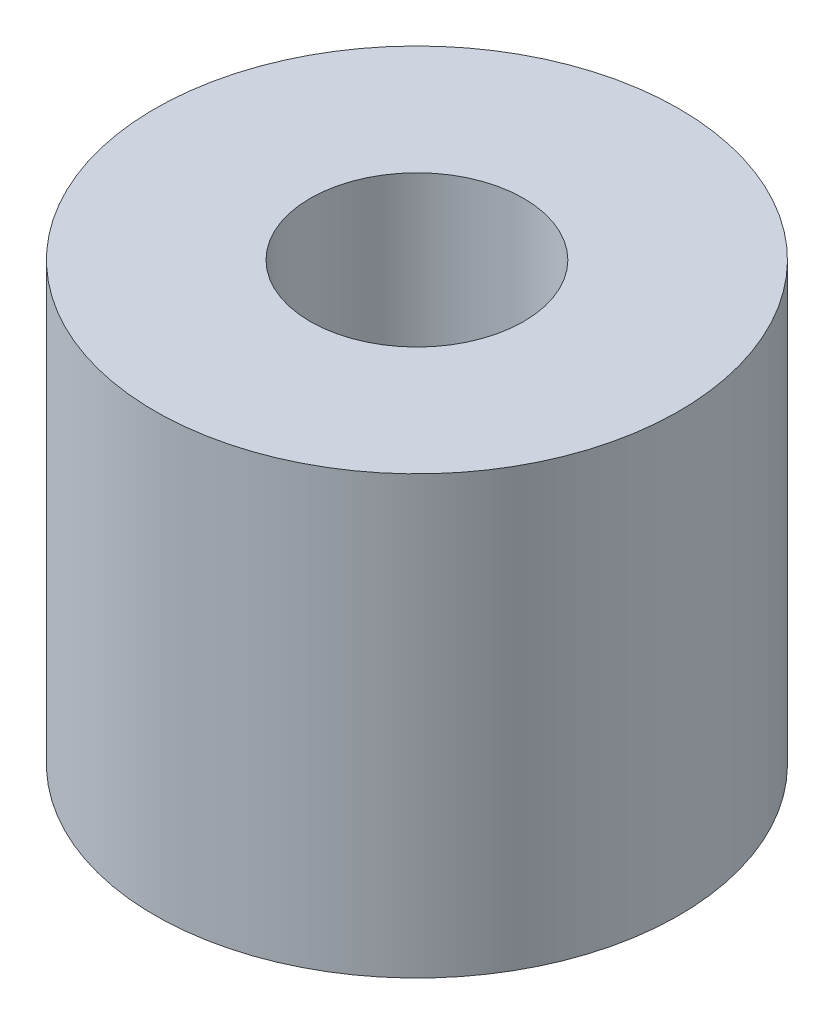
ISO-10303-21;
HEADER;
FILE_DESCRIPTION(('STEP AP214'),'2;1');
FILE_NAME('part.step','',(''),(''),'','','');
FILE_SCHEMA(('AUTOMOTIVE_DESIGN { 1 0 10303 214 1 1 1 1 }'));
ENDSEC;
DATA;
#1=APPLICATION_CONTEXT('core data for automotive mechanical design processes');
#2=APPLICATION_PROTOCOL_DEFINITION('international standard','automotive_design',2000,#1);
#3=PRODUCT_CONTEXT('',#1,'mechanical');
#4=PRODUCT('Part','Part','',(#3));
#5=PRODUCT_RELATED_PRODUCT_CATEGORY('part','',(#4));
#6=PRODUCT_DEFINITION_FORMATION('','',#4);
#7=PRODUCT_DEFINITION_CONTEXT('part definition',#1,'design');
#8=PRODUCT_DEFINITION('design','',#6,#7);
#9=PRODUCT_DEFINITION_SHAPE('','',#8);
#10=(LENGTH_UNIT() NAMED_UNIT(*) SI_UNIT(.MILLI.,.METRE.));
#11=(NAMED_UNIT(*) PLANE_ANGLE_UNIT() SI_UNIT($,.RADIAN.));
#12=(NAMED_UNIT(*) SI_UNIT($,.STERADIAN.) SOLID_ANGLE_UNIT());
#13=UNCERTAINTY_MEASURE_WITH_UNIT(LENGTH_MEASURE(1.E-05),#10,'distance_accuracy_value','');
#14=(GEOMETRIC_REPRESENTATION_CONTEXT(3) GLOBAL_UNCERTAINTY_ASSIGNED_CONTEXT((#13)) GLOBAL_UNIT_ASSIGNED_CONTEXT((#10,
#11,#12)) REPRESENTATION_CONTEXT('',''));
#15=CARTESIAN_POINT('',(0.,0.,0.));
#16=DIRECTION('',(0.,0.,1.));
#17=DIRECTION('',(1.,0.,0.));
#18=AXIS2_PLACEMENT_3D('',#15,#16,#17);
#19=CARTESIAN_POINT('',(0.,45.,0.));
#20=DIRECTION('',(0.,-1.,0.));
#21=DIRECTION('',(0.,0.,-1.));
#22=AXIS2_PLACEMENT_3D('',#19,#20,#21);
#23=CYLINDRICAL_SURFACE('',#22,27.);
#24=CARTESIAN_POINT('',(0.,45.,0.));
#25=DIRECTION('',(0.,1.,0.));
#26=DIRECTION('',(0.,0.,1.));
#27=AXIS2_PLACEMENT_3D('',#24,#25,#26);
#28=CIRCLE('',#27,27.);
#29=CARTESIAN_POINT('',(0.,45.,-27.));
#30=VERTEX_POINT('',#29);
#31=EDGE_CURVE('E11',#30,#30,#28,.T.);
#32=CARTESIAN_POINT('',(0.,0.,0.));
#33=DIRECTION('',(0.,1.,0.));
#34=DIRECTION('',(0.,0.,1.));
#35=AXIS2_PLACEMENT_3D('',#32,#33,#34);
#36=CIRCLE('',#35,27.);
#37=CARTESIAN_POINT('',(0.,0.,-27.));
#38=VERTEX_POINT('',#37);
#39=EDGE_CURVE('E40',#38,#38,#36,.T.);
#40=CARTESIAN_POINT('',(0.,45.,-27.));
#41=CARTESIAN_POINT('',(0.,44.53125,-27.));
#42=CARTESIAN_POINT('',(0.,44.0625,-27.));
#43=CARTESIAN_POINT('',(0.,43.125,-27.));
#44=CARTESIAN_POINT('',(0.,42.65625,-27.));
#45=CARTESIAN_POINT('',(0.,41.71875,-27.));
#46=CARTESIAN_POINT('',(0.,41.25,-27.));
#47=CARTESIAN_POINT('',(0.,40.3125,-27.));
#48=CARTESIAN_POINT('',(0.,39.84375,-27.));
#49=CARTESIAN_POINT('',(0.,38.90625,-27.));
#50=CARTESIAN_POINT('',(0.,38.4375,-27.));
#51=CARTESIAN_POINT('',(0.,37.5,-27.));
#52=CARTESIAN_POINT('',(0.,37.03125,-27.));
#53=CARTESIAN_POINT('',(0.,36.09375,-27.));
#54=CARTESIAN_POINT('',(0.,35.625,-27.));
#55=CARTESIAN_POINT('',(0.,34.6875,-27.));
#56=CARTESIAN_POINT('',(0.,34.21875,-27.));
#57=CARTESIAN_POINT('',(0.,33.28125,-27.));
#58=CARTESIAN_POINT('',(0.,32.8125,-27.));
#59=CARTESIAN_POINT('',(0.,31.875,-27.));
#60=CARTESIAN_POINT('',(0.,31.40625,-27.));
#61=CARTESIAN_POINT('',(0.,30.46875,-27.));
#62=CARTESIAN_POINT('',(0.,30.,-27.));
#63=CARTESIAN_POINT('',(0.,29.0625,-27.));
#64=CARTESIAN_POINT('',(0.,28.59375,-27.));
#65=CARTESIAN_POINT('',(0.,27.65625,-27.));
#66=CARTESIAN_POINT('',(0.,27.1875,-27.));
#67=CARTESIAN_POINT('',(0.,26.25,-27.));
#68=CARTESIAN_POINT('',(0.,25.78125,-27.));
#69=CARTESIAN_POINT('',(0.,24.84375,-27.));
#70=CARTESIAN_POINT('',(0.,24.375,-27.));
#71=CARTESIAN_POINT('',(0.,23.4375,-27.));
#72=CARTESIAN_POINT('',(0.,22.96875,-27.));
#73=CARTESIAN_POINT('',(0.,22.03125,-27.));
#74=CARTESIAN_POINT('',(0.,21.5625,-27.));
#75=CARTESIAN_POINT('',(0.,20.625,-27.));
#76=CARTESIAN_POINT('',(0.,20.15625,-27.));
#77=CARTESIAN_POINT('',(0.,19.21875,-27.));
#78=CARTESIAN_POINT('',(0.,18.75,-27.));
#79=CARTESIAN_POINT('',(0.,17.8125,-27.));
#80=CARTESIAN_POINT('',(0.,17.34375,-27.));
#81=CARTESIAN_POINT('',(0.,16.40625,-27.));
#82=CARTESIAN_POINT('',(0.,15.9375,-27.));
#83=CARTESIAN_POINT('',(0.,15.,-27.));
#84=CARTESIAN_POINT('',(0.,14.53125,-27.));
#85=CARTESIAN_POINT('',(0.,13.59375,-27.));
#86=CARTESIAN_POINT('',(0.,13.125,-27.));
#87=CARTESIAN_POINT('',(0.,12.1875,-27.));
#88=CARTESIAN_POINT('',(0.,11.71875,-27.));
#89=CARTESIAN_POINT('',(0.,10.78125,-27.));
#90=CARTESIAN_POINT('',(0.,10.3125,-27.));
#91=CARTESIAN_POINT('',(0.,9.37499999999999,-27.));
#92=CARTESIAN_POINT('',(0.,8.90624999999999,-27.));
#93=CARTESIAN_POINT('',(0.,7.96874999999999,-27.));
#94=CARTESIAN_POINT('',(0.,7.5,-27.));
#95=CARTESIAN_POINT('',(0.,6.56249999999999,-27.));
#96=CARTESIAN_POINT('',(0.,6.09374999999999,-27.));
#97=CARTESIAN_POINT('',(0.,5.15624999999999,-27.));
#98=CARTESIAN_POINT('',(0.,4.68749999999999,-27.));
#99=CARTESIAN_POINT('',(0.,3.74999999999999,-27.));
#100=CARTESIAN_POINT('',(0.,3.28124999999999,-27.));
#101=CARTESIAN_POINT('',(0.,2.34374999999999,-27.));
#102=CARTESIAN_POINT('',(0.,1.87499999999999,-27.));
#103=CARTESIAN_POINT('',(0.,0.937499999999992,-27.));
#104=CARTESIAN_POINT('',(0.,0.468749999999993,-27.));
#105=CARTESIAN_POINT('',(0.,0.,-27.));
#106=B_SPLINE_CURVE_WITH_KNOTS('',3,(#40,#41,#42,#43,#44,#45,#46,#47,#48,#49,#50,#51,#52,#53,
#54,#55,#56,#57,#58,#59,#60,#61,#62,#63,#64,#65,#66,#67,#68,#69,#70,#71,#72,#73,#74,#75,#76,#77,
#78,#79,#80,#81,#82,#83,#84,#85,#86,#87,#88,#89,#90,#91,#92,#93,#94,#95,#96,#97,#98,#99,#100,
#101,#102,#103,#104,#105),.UNSPECIFIED.,.F.,.F.,(4,2,2,2,2,2,2,2,2,2,2,2,2,2,2,2,2,2,2,2,2,2,2,
2,2,2,2,2,2,2,2,2,4),(0.,1.40625,2.8125,4.21874999999999,5.625,7.03125,8.43749999999999,9.84375,
11.25,12.65625,14.0625,15.46875,16.875,18.28125,19.6875,21.09375,22.5,23.90625,25.3125,26.71875,
28.125,29.53125,30.9375,32.34375,33.75,35.15625,36.5625,37.96875,39.375,40.78125,42.1875,
43.59375,45.),.UNSPECIFIED.);
#107=EDGE_CURVE('BSEAM37',#30,#38,#106,.T.);
#108=ORIENTED_EDGE('',*,*,#31,.F.);
#109=ORIENTED_EDGE('',*,*,#39,.T.);
#110=ORIENTED_EDGE('',*,*,#107,.T.);
#111=ORIENTED_EDGE('',*,*,#107,.F.);
#112=EDGE_LOOP('',(#108,#110,#109,#111));
#113=FACE_BOUND('',#112,.T.);
#114=ADVANCED_FACE('F37',(#113),#23,.T.);
#115=CARTESIAN_POINT('',(0.,45.,0.));
#116=DIRECTION('',(0.,1.,0.));
#117=DIRECTION('',(0.,0.,1.));
#118=AXIS2_PLACEMENT_3D('',#115,#116,#117);
#119=PLANE('',#118);
#120=CARTESIAN_POINT('',(0.,45.,0.));
#121=DIRECTION('',(0.,1.,0.));
#122=DIRECTION('',(0.,0.,1.));
#123=AXIS2_PLACEMENT_3D('',#120,#121,#122);
#124=CIRCLE('',#123,11.);
#125=CARTESIAN_POINT('',(0.,45.,11.));
#126=VERTEX_POINT('',#125);
#127=EDGE_CURVE('E113',#126,#126,#124,.T.);
#128=ORIENTED_EDGE('',*,*,#127,.F.);
#129=EDGE_LOOP('',(#128));
#130=FACE_BOUND('',#129,.T.);
#131=ORIENTED_EDGE('',*,*,#31,.T.);
#132=EDGE_LOOP('',(#131));
#133=FACE_BOUND('',#132,.T.);
#134=ADVANCED_FACE('F124',(#130,#133),#119,.T.);
#135=CARTESIAN_POINT('',(0.,0.,0.));
#136=DIRECTION('',(0.,1.,0.));
#137=DIRECTION('',(0.,0.,1.));
#138=AXIS2_PLACEMENT_3D('',#135,#136,#137);
#139=PLANE('',#138);
#140=CARTESIAN_POINT('',(0.,0.,0.));
#141=DIRECTION('',(0.,-1.,0.));
#142=DIRECTION('',(0.,0.,-1.));
#143=AXIS2_PLACEMENT_3D('',#140,#141,#142);
#144=CIRCLE('',#143,7.);
#145=CARTESIAN_POINT('',(-2.6,0.,6.49923072370877));
#146=VERTEX_POINT('',#145);
#147=CARTESIAN_POINT('',(2.6,0.,6.49923072370877));
#148=VERTEX_POINT('',#147);
#149=EDGE_CURVE('E96',#146,#148,#144,.T.);
#150=ORIENTED_EDGE('',*,*,#149,.F.);
#151=DIRECTION('',(0.,0.,-1.));
#152=VECTOR('',#151,1.);
#153=CARTESIAN_POINT('',(-2.6,0.,10.2));
#154=LINE('',#153,#152);
#155=CARTESIAN_POINT('',(-2.6,0.,10.2));
#156=VERTEX_POINT('',#155);
#157=EDGE_CURVE('E51',#156,#146,#154,.T.);
#158=ORIENTED_EDGE('',*,*,#157,.F.);
#159=DIRECTION('',(1.,0.,0.));
#160=VECTOR('',#159,1.);
#161=CARTESIAN_POINT('',(-2.6,0.,10.2));
#162=LINE('',#161,#160);
#163=CARTESIAN_POINT('',(2.6,0.,10.2));
#164=VERTEX_POINT('',#163);
#165=EDGE_CURVE('E102',#156,#164,#162,.T.);
#166=ORIENTED_EDGE('',*,*,#165,.T.);
#167=DIRECTION('',(0.,0.,-1.));
#168=VECTOR('',#167,1.);
#169=CARTESIAN_POINT('',(2.6,0.,10.2));
#170=LINE('',#169,#168);
#171=EDGE_CURVE('E108',#164,#148,#170,.T.);
#172=ORIENTED_EDGE('',*,*,#171,.T.);
#173=EDGE_LOOP('',(#150,#158,#166,#172));
#174=FACE_BOUND('',#173,.T.);
#175=ORIENTED_EDGE('',*,*,#39,.F.);
#176=EDGE_LOOP('',(#175));
#177=FACE_BOUND('',#176,.T.);
#178=ADVANCED_FACE('F127',(#174,#177),#139,.F.);
#179=CARTESIAN_POINT('',(0.,25.,0.));
#180=DIRECTION('',(0.,1.,0.));
#181=DIRECTION('',(0.,0.,1.));
#182=AXIS2_PLACEMENT_3D('',#179,#180,#181);
#183=CYLINDRICAL_SURFACE('',#182,11.);
#184=CARTESIAN_POINT('',(0.,25.,0.));
#185=DIRECTION('',(0.,1.,0.));
#186=DIRECTION('',(0.,0.,1.));
#187=AXIS2_PLACEMENT_3D('',#184,#185,#186);
#188=CIRCLE('',#187,11.);
#189=CARTESIAN_POINT('',(0.,25.,11.));
#190=VERTEX_POINT('',#189);
#191=EDGE_CURVE('E116',#190,#190,#188,.T.);
#192=ORIENTED_EDGE('',*,*,#191,.F.);
#193=EDGE_LOOP('',(#192));
#194=FACE_BOUND('',#193,.T.);
#195=ORIENTED_EDGE('',*,*,#127,.T.);
#196=EDGE_LOOP('',(#195));
#197=FACE_BOUND('',#196,.T.);
#198=ADVANCED_FACE('F122',(#194,#197),#183,.F.);
#199=CARTESIAN_POINT('',(0.,25.,0.));
#200=DIRECTION('',(0.,1.,0.));
#201=DIRECTION('',(0.,0.,1.));
#202=AXIS2_PLACEMENT_3D('',#199,#200,#201);
#203=PLANE('',#202);
#204=ORIENTED_EDGE('',*,*,#191,.T.);
#205=EDGE_LOOP('',(#204));
#206=FACE_BOUND('',#205,.T.);
#207=ADVANCED_FACE('F143',(#206),#203,.T.);
#208=CARTESIAN_POINT('',(-2.6,20.,10.2));
#209=DIRECTION('',(-1.,0.,0.));
#210=DIRECTION('',(0.,0.,1.));
#211=AXIS2_PLACEMENT_3D('',#208,#209,#210);
#212=PLANE('',#211);
#213=ORIENTED_EDGE('',*,*,#157,.T.);
#214=DIRECTION('',(0.,-1.,0.));
#215=VECTOR('',#214,1.);
#216=CARTESIAN_POINT('',(-2.6,20.,6.49923072370877));
#217=LINE('',#216,#215);
#218=CARTESIAN_POINT('',(-2.6,20.,6.49923072370877));
#219=VERTEX_POINT('',#218);
#220=EDGE_CURVE('E74',#219,#146,#217,.T.);
#221=ORIENTED_EDGE('',*,*,#220,.F.);
#222=DIRECTION('',(0.,0.,-1.));
#223=VECTOR('',#222,1.);
#224=CARTESIAN_POINT('',(-2.6,20.,10.2));
#225=LINE('',#224,#223);
#226=CARTESIAN_POINT('',(-2.6,20.,10.2));
#227=VERTEX_POINT('',#226);
#228=EDGE_CURVE('E100',#227,#219,#225,.T.);
#229=ORIENTED_EDGE('',*,*,#228,.F.);
#230=DIRECTION('',(0.,-1.,0.));
#231=VECTOR('',#230,1.);
#232=CARTESIAN_POINT('',(-2.6,20.,10.2));
#233=LINE('',#232,#231);
#234=EDGE_CURVE('E59',#227,#156,#233,.T.);
#235=ORIENTED_EDGE('',*,*,#234,.T.);
#236=EDGE_LOOP('',(#213,#221,#229,#235));
#237=FACE_BOUND('',#236,.T.);
#238=ADVANCED_FACE('F149',(#237),#212,.F.);
#239=CARTESIAN_POINT('',(-2.6,20.,10.2));
#240=DIRECTION('',(0.,0.,-1.));
#241=DIRECTION('',(-1.,0.,0.));
#242=AXIS2_PLACEMENT_3D('',#239,#240,#241);
#243=PLANE('',#242);
#244=ORIENTED_EDGE('',*,*,#165,.F.);
#245=ORIENTED_EDGE('',*,*,#234,.F.);
#246=DIRECTION('',(1.,0.,0.));
#247=VECTOR('',#246,1.);
#248=CARTESIAN_POINT('',(-2.6,20.,10.2));
#249=LINE('',#248,#247);
#250=CARTESIAN_POINT('',(2.6,20.,10.2));
#251=VERTEX_POINT('',#250);
#252=EDGE_CURVE('E89',#227,#251,#249,.T.);
#253=ORIENTED_EDGE('',*,*,#252,.T.);
#254=DIRECTION('',(0.,-1.,0.));
#255=VECTOR('',#254,1.);
#256=CARTESIAN_POINT('',(2.6,20.,10.2));
#257=LINE('',#256,#255);
#258=EDGE_CURVE('E86',#251,#164,#257,.T.);
#259=ORIENTED_EDGE('',*,*,#258,.T.);
#260=EDGE_LOOP('',(#244,#245,#253,#259));
#261=FACE_BOUND('',#260,.T.);
#262=ADVANCED_FACE('F153',(#261),#243,.T.);
#263=CARTESIAN_POINT('',(2.6,20.,10.2));
#264=DIRECTION('',(-1.,0.,0.));
#265=DIRECTION('',(0.,0.,1.));
#266=AXIS2_PLACEMENT_3D('',#263,#264,#265);
#267=PLANE('',#266);
#268=ORIENTED_EDGE('',*,*,#171,.F.);
#269=ORIENTED_EDGE('',*,*,#258,.F.);
#270=DIRECTION('',(0.,0.,-1.));
#271=VECTOR('',#270,1.);
#272=CARTESIAN_POINT('',(2.6,20.,10.2));
#273=LINE('',#272,#271);
#274=CARTESIAN_POINT('',(2.6,20.,6.49923072370877));
#275=VERTEX_POINT('',#274);
#276=EDGE_CURVE('E80',#251,#275,#273,.T.);
#277=ORIENTED_EDGE('',*,*,#276,.T.);
#278=DIRECTION('',(0.,-1.,0.));
#279=VECTOR('',#278,1.);
#280=CARTESIAN_POINT('',(2.6,20.,6.49923072370877));
#281=LINE('',#280,#279);
#282=EDGE_CURVE('E84',#275,#148,#281,.T.);
#283=ORIENTED_EDGE('',*,*,#282,.T.);
#284=EDGE_LOOP('',(#268,#269,#277,#283));
#285=FACE_BOUND('',#284,.T.);
#286=ADVANCED_FACE('F83',(#285),#267,.T.);
#287=CARTESIAN_POINT('',(0.,20.,0.));
#288=DIRECTION('',(0.,-1.,0.));
#289=DIRECTION('',(0.,0.,-1.));
#290=AXIS2_PLACEMENT_3D('',#287,#288,#289);
#291=CYLINDRICAL_SURFACE('',#290,7.);
#292=ORIENTED_EDGE('',*,*,#149,.T.);
#293=ORIENTED_EDGE('',*,*,#282,.F.);
#294=CARTESIAN_POINT('',(0.,20.,0.));
#295=DIRECTION('',(0.,-1.,0.));
#296=DIRECTION('',(0.,0.,-1.));
#297=AXIS2_PLACEMENT_3D('',#294,#295,#296);
#298=CIRCLE('',#297,7.);
#299=EDGE_CURVE('E90',#219,#275,#298,.T.);
#300=ORIENTED_EDGE('',*,*,#299,.F.);
#301=ORIENTED_EDGE('',*,*,#220,.T.);
#302=EDGE_LOOP('',(#292,#293,#300,#301));
#303=FACE_BOUND('',#302,.T.);
#304=ADVANCED_FACE('F93',(#303),#291,.F.);
#305=CARTESIAN_POINT('',(0.,20.,0.));
#306=DIRECTION('',(0.,-1.,0.));
#307=DIRECTION('',(0.,0.,-1.));
#308=AXIS2_PLACEMENT_3D('',#305,#306,#307);
#309=PLANE('',#308);
#310=ORIENTED_EDGE('',*,*,#228,.T.);
#311=ORIENTED_EDGE('',*,*,#299,.T.);
#312=ORIENTED_EDGE('',*,*,#276,.F.);
#313=ORIENTED_EDGE('',*,*,#252,.F.);
#314=EDGE_LOOP('',(#310,#311,#312,#313));
#315=FACE_BOUND('',#314,.T.);
#316=ADVANCED_FACE('F99',(#315),#309,.T.);
#317=CLOSED_SHELL('',(#114,#134,#178,#198,#207,#238,#262,#286,#304,#316));
#318=MANIFOLD_SOLID_BREP('B2',#317);
#319=ADVANCED_BREP_SHAPE_REPRESENTATION('',(#18,#318),#14);
#320=SHAPE_DEFINITION_REPRESENTATION(#9,#319);
ENDSEC;
END-ISO-10303-21;
